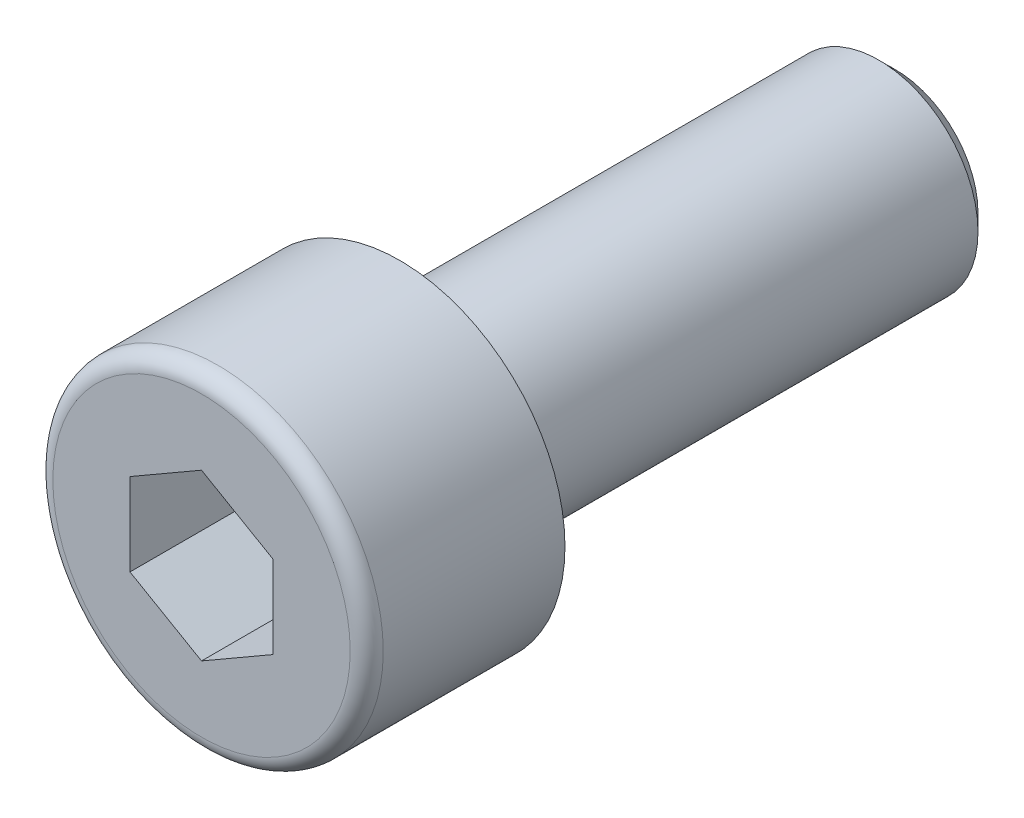
ISO-10303-21;
HEADER;
FILE_DESCRIPTION(('STEP AP214'),'2;1');
FILE_NAME('part.step','',(''),(''),'','','');
FILE_SCHEMA(('AUTOMOTIVE_DESIGN { 1 0 10303 214 1 1 1 1 }'));
ENDSEC;
DATA;
#1=APPLICATION_CONTEXT('core data for automotive mechanical design processes');
#2=APPLICATION_PROTOCOL_DEFINITION('international standard','automotive_design',2000,#1);
#3=PRODUCT_CONTEXT('',#1,'mechanical');
#4=PRODUCT('Part','Part','',(#3));
#5=PRODUCT_RELATED_PRODUCT_CATEGORY('part','',(#4));
#6=PRODUCT_DEFINITION_FORMATION('','',#4);
#7=PRODUCT_DEFINITION_CONTEXT('part definition',#1,'design');
#8=PRODUCT_DEFINITION('design','',#6,#7);
#9=PRODUCT_DEFINITION_SHAPE('','',#8);
#10=(LENGTH_UNIT() NAMED_UNIT(*) SI_UNIT(.MILLI.,.METRE.));
#11=(NAMED_UNIT(*) PLANE_ANGLE_UNIT() SI_UNIT($,.RADIAN.));
#12=(NAMED_UNIT(*) SI_UNIT($,.STERADIAN.) SOLID_ANGLE_UNIT());
#13=UNCERTAINTY_MEASURE_WITH_UNIT(LENGTH_MEASURE(1.E-05),#10,'distance_accuracy_value','');
#14=(GEOMETRIC_REPRESENTATION_CONTEXT(3) GLOBAL_UNCERTAINTY_ASSIGNED_CONTEXT((#13)) GLOBAL_UNIT_ASSIGNED_CONTEXT((#10,
#11,#12)) REPRESENTATION_CONTEXT('',''));
#15=CARTESIAN_POINT('',(0.,0.,0.));
#16=DIRECTION('',(0.,0.,1.));
#17=DIRECTION('',(1.,0.,0.));
#18=AXIS2_PLACEMENT_3D('',#15,#16,#17);
#19=CARTESIAN_POINT('',(0.,0.,15.));
#20=DIRECTION('',(0.,0.,-1.));
#21=DIRECTION('',(-1.,0.,0.));
#22=AXIS2_PLACEMENT_3D('',#19,#20,#21);
#23=CYLINDRICAL_SURFACE('',#22,3.);
#24=CARTESIAN_POINT('',(0.,0.,0.500000000000009));
#25=DIRECTION('',(0.,0.,1.));
#26=DIRECTION('',(1.,0.,0.));
#27=AXIS2_PLACEMENT_3D('',#24,#25,#26);
#28=CIRCLE('',#27,3.);
#29=CARTESIAN_POINT('',(3.,0.,0.500000000000009));
#30=VERTEX_POINT('',#29);
#31=EDGE_CURVE('E42',#30,#30,#28,.T.);
#32=ORIENTED_EDGE('',*,*,#31,.T.);
#33=EDGE_LOOP('',(#32));
#34=FACE_BOUND('',#33,.T.);
#35=CARTESIAN_POINT('',(0.,0.,15.));
#36=DIRECTION('',(0.,0.,1.));
#37=DIRECTION('',(1.,0.,0.));
#38=AXIS2_PLACEMENT_3D('',#35,#36,#37);
#39=CIRCLE('',#38,3.);
#40=CARTESIAN_POINT('',(3.,0.,15.));
#41=VERTEX_POINT('',#40);
#42=EDGE_CURVE('E145',#41,#41,#39,.T.);
#43=ORIENTED_EDGE('',*,*,#42,.F.);
#44=EDGE_LOOP('',(#43));
#45=FACE_BOUND('',#44,.T.);
#46=ADVANCED_FACE('F35',(#34,#45),#23,.T.);
#47=CARTESIAN_POINT('',(0.,0.,0.));
#48=DIRECTION('',(0.,0.,1.));
#49=DIRECTION('',(1.,0.,0.));
#50=AXIS2_PLACEMENT_3D('',#47,#48,#49);
#51=PLANE('',#50);
#52=CARTESIAN_POINT('',(0.,0.,0.));
#53=DIRECTION('',(0.,0.,1.));
#54=DIRECTION('',(1.,0.,0.));
#55=AXIS2_PLACEMENT_3D('',#52,#53,#54);
#56=CIRCLE('',#55,2.5);
#57=CARTESIAN_POINT('',(2.5,0.,0.));
#58=VERTEX_POINT('',#57);
#59=EDGE_CURVE('E11',#58,#58,#56,.F.);
#60=ORIENTED_EDGE('',*,*,#59,.T.);
#61=EDGE_LOOP('',(#60));
#62=FACE_BOUND('',#61,.T.);
#63=ADVANCED_FACE('F171',(#62),#51,.F.);
#64=CARTESIAN_POINT('',(0.,0.,15.));
#65=DIRECTION('',(0.,0.,1.));
#66=DIRECTION('',(1.,0.,0.));
#67=AXIS2_PLACEMENT_3D('',#64,#65,#66);
#68=PLANE('',#67);
#69=CARTESIAN_POINT('',(0.,0.,15.));
#70=DIRECTION('',(0.,0.,1.));
#71=DIRECTION('',(1.,0.,0.));
#72=AXIS2_PLACEMENT_3D('',#69,#70,#71);
#73=CIRCLE('',#72,5.);
#74=CARTESIAN_POINT('',(5.,0.,15.));
#75=VERTEX_POINT('',#74);
#76=EDGE_CURVE('E136',#75,#75,#73,.T.);
#77=ORIENTED_EDGE('',*,*,#76,.F.);
#78=EDGE_LOOP('',(#77));
#79=FACE_BOUND('',#78,.T.);
#80=ORIENTED_EDGE('',*,*,#42,.T.);
#81=EDGE_LOOP('',(#80));
#82=FACE_BOUND('',#81,.T.);
#83=ADVANCED_FACE('F175',(#79,#82),#68,.F.);
#84=CARTESIAN_POINT('',(0.,0.,21.));
#85=DIRECTION('',(0.,0.,-1.));
#86=DIRECTION('',(-1.,0.,0.));
#87=AXIS2_PLACEMENT_3D('',#84,#85,#86);
#88=CYLINDRICAL_SURFACE('',#87,5.);
#89=CARTESIAN_POINT('',(0.,0.,20.5));
#90=DIRECTION('',(0.,0.,1.));
#91=DIRECTION('',(1.,0.,0.));
#92=AXIS2_PLACEMENT_3D('',#89,#90,#91);
#93=CIRCLE('',#92,5.);
#94=CARTESIAN_POINT('',(5.,0.,20.5));
#95=VERTEX_POINT('',#94);
#96=EDGE_CURVE('E151',#95,#95,#93,.F.);
#97=ORIENTED_EDGE('',*,*,#96,.T.);
#98=EDGE_LOOP('',(#97));
#99=FACE_BOUND('',#98,.T.);
#100=ORIENTED_EDGE('',*,*,#76,.T.);
#101=EDGE_LOOP('',(#100));
#102=FACE_BOUND('',#101,.T.);
#103=ADVANCED_FACE('F180',(#99,#102),#88,.T.);
#104=CARTESIAN_POINT('',(0.,0.,21.));
#105=DIRECTION('',(0.,0.,1.));
#106=DIRECTION('',(1.,0.,0.));
#107=AXIS2_PLACEMENT_3D('',#104,#105,#106);
#108=PLANE('',#107);
#109=CARTESIAN_POINT('',(0.,0.,21.));
#110=DIRECTION('',(0.,0.,1.));
#111=DIRECTION('',(1.,0.,0.));
#112=AXIS2_PLACEMENT_3D('',#109,#110,#111);
#113=CIRCLE('',#112,4.5);
#114=CARTESIAN_POINT('',(4.5,0.,21.));
#115=VERTEX_POINT('',#114);
#116=EDGE_CURVE('E148',#115,#115,#113,.T.);
#117=ORIENTED_EDGE('',*,*,#116,.T.);
#118=EDGE_LOOP('',(#117));
#119=FACE_BOUND('',#118,.T.);
#120=DIRECTION('',(-0.866025403784439,0.5,0.));
#121=VECTOR('',#120,1.);
#122=CARTESIAN_POINT('',(2.1650635094611,1.25,21.));
#123=LINE('',#122,#121);
#124=CARTESIAN_POINT('',(2.1650635094611,1.25,21.));
#125=VERTEX_POINT('',#124);
#126=CARTESIAN_POINT('',(0.,2.5,21.));
#127=VERTEX_POINT('',#126);
#128=EDGE_CURVE('E49',#125,#127,#123,.T.);
#129=ORIENTED_EDGE('',*,*,#128,.F.);
#130=DIRECTION('',(0.,1.,0.));
#131=VECTOR('',#130,1.);
#132=CARTESIAN_POINT('',(2.1650635094611,-1.25,21.));
#133=LINE('',#132,#131);
#134=CARTESIAN_POINT('',(2.1650635094611,-1.25,21.));
#135=VERTEX_POINT('',#134);
#136=EDGE_CURVE('E118',#135,#125,#133,.T.);
#137=ORIENTED_EDGE('',*,*,#136,.F.);
#138=DIRECTION('',(0.866025403784439,0.5,0.));
#139=VECTOR('',#138,1.);
#140=CARTESIAN_POINT('',(0.,-2.5,21.));
#141=LINE('',#140,#139);
#142=CARTESIAN_POINT('',(0.,-2.5,21.));
#143=VERTEX_POINT('',#142);
#144=EDGE_CURVE('E112',#143,#135,#141,.T.);
#145=ORIENTED_EDGE('',*,*,#144,.F.);
#146=DIRECTION('',(0.866025403784439,-0.5,0.));
#147=VECTOR('',#146,1.);
#148=CARTESIAN_POINT('',(-2.1650635094611,-1.25,21.));
#149=LINE('',#148,#147);
#150=CARTESIAN_POINT('',(-2.1650635094611,-1.25,21.));
#151=VERTEX_POINT('',#150);
#152=EDGE_CURVE('E110',#151,#143,#149,.T.);
#153=ORIENTED_EDGE('',*,*,#152,.F.);
#154=DIRECTION('',(0.,-1.,0.));
#155=VECTOR('',#154,1.);
#156=CARTESIAN_POINT('',(-2.1650635094611,1.25,21.));
#157=LINE('',#156,#155);
#158=CARTESIAN_POINT('',(-2.1650635094611,1.25,21.));
#159=VERTEX_POINT('',#158);
#160=EDGE_CURVE('E92',#159,#151,#157,.T.);
#161=ORIENTED_EDGE('',*,*,#160,.F.);
#162=DIRECTION('',(-0.866025403784439,-0.5,0.));
#163=VECTOR('',#162,1.);
#164=CARTESIAN_POINT('',(0.,2.5,21.));
#165=LINE('',#164,#163);
#166=EDGE_CURVE('E103',#127,#159,#165,.T.);
#167=ORIENTED_EDGE('',*,*,#166,.F.);
#168=EDGE_LOOP('',(#129,#137,#145,#153,#161,#167));
#169=FACE_BOUND('',#168,.T.);
#170=ADVANCED_FACE('F107',(#119,#169),#108,.T.);
#171=CARTESIAN_POINT('',(2.1650635094611,1.25,17.5));
#172=DIRECTION('',(0.5,0.866025403784439,0.));
#173=DIRECTION('',(-0.866025403784439,0.5,0.));
#174=AXIS2_PLACEMENT_3D('',#171,#172,#173);
#175=PLANE('',#174);
#176=ORIENTED_EDGE('',*,*,#128,.T.);
#177=DIRECTION('',(0.,0.,1.));
#178=VECTOR('',#177,1.);
#179=CARTESIAN_POINT('',(0.,2.5,17.5));
#180=LINE('',#179,#178);
#181=CARTESIAN_POINT('',(0.,2.5,17.5));
#182=VERTEX_POINT('',#181);
#183=EDGE_CURVE('E100',#182,#127,#180,.T.);
#184=ORIENTED_EDGE('',*,*,#183,.F.);
#185=DIRECTION('',(-0.866025403784439,0.5,0.));
#186=VECTOR('',#185,1.);
#187=CARTESIAN_POINT('',(2.1650635094611,1.25,17.5));
#188=LINE('',#187,#186);
#189=CARTESIAN_POINT('',(2.1650635094611,1.25,17.5));
#190=VERTEX_POINT('',#189);
#191=EDGE_CURVE('E120',#190,#182,#188,.T.);
#192=ORIENTED_EDGE('',*,*,#191,.F.);
#193=DIRECTION('',(0.,0.,1.));
#194=VECTOR('',#193,1.);
#195=CARTESIAN_POINT('',(2.1650635094611,1.25,17.5));
#196=LINE('',#195,#194);
#197=EDGE_CURVE('E56',#190,#125,#196,.T.);
#198=ORIENTED_EDGE('',*,*,#197,.T.);
#199=EDGE_LOOP('',(#176,#184,#192,#198));
#200=FACE_BOUND('',#199,.T.);
#201=ADVANCED_FACE('F188',(#200),#175,.F.);
#202=CARTESIAN_POINT('',(2.1650635094611,-1.25,17.5));
#203=DIRECTION('',(1.,0.,0.));
#204=DIRECTION('',(0.,1.,0.));
#205=AXIS2_PLACEMENT_3D('',#202,#203,#204);
#206=PLANE('',#205);
#207=ORIENTED_EDGE('',*,*,#136,.T.);
#208=ORIENTED_EDGE('',*,*,#197,.F.);
#209=DIRECTION('',(0.,1.,0.));
#210=VECTOR('',#209,1.);
#211=CARTESIAN_POINT('',(2.1650635094611,-1.25,17.5));
#212=LINE('',#211,#210);
#213=CARTESIAN_POINT('',(2.1650635094611,-1.25,17.5));
#214=VERTEX_POINT('',#213);
#215=EDGE_CURVE('E132',#214,#190,#212,.T.);
#216=ORIENTED_EDGE('',*,*,#215,.F.);
#217=DIRECTION('',(0.,0.,1.));
#218=VECTOR('',#217,1.);
#219=CARTESIAN_POINT('',(2.1650635094611,-1.25,17.5));
#220=LINE('',#219,#218);
#221=EDGE_CURVE('E137',#214,#135,#220,.T.);
#222=ORIENTED_EDGE('',*,*,#221,.T.);
#223=EDGE_LOOP('',(#207,#208,#216,#222));
#224=FACE_BOUND('',#223,.T.);
#225=ADVANCED_FACE('F193',(#224),#206,.F.);
#226=CARTESIAN_POINT('',(0.,-2.5,17.5));
#227=DIRECTION('',(0.5,-0.866025403784439,0.));
#228=DIRECTION('',(0.866025403784439,0.5,0.));
#229=AXIS2_PLACEMENT_3D('',#226,#227,#228);
#230=PLANE('',#229);
#231=ORIENTED_EDGE('',*,*,#144,.T.);
#232=ORIENTED_EDGE('',*,*,#221,.F.);
#233=DIRECTION('',(0.866025403784439,0.5,0.));
#234=VECTOR('',#233,1.);
#235=CARTESIAN_POINT('',(0.,-2.5,17.5));
#236=LINE('',#235,#234);
#237=CARTESIAN_POINT('',(0.,-2.5,17.5));
#238=VERTEX_POINT('',#237);
#239=EDGE_CURVE('E129',#238,#214,#236,.T.);
#240=ORIENTED_EDGE('',*,*,#239,.F.);
#241=DIRECTION('',(0.,0.,1.));
#242=VECTOR('',#241,1.);
#243=CARTESIAN_POINT('',(0.,-2.5,17.5));
#244=LINE('',#243,#242);
#245=EDGE_CURVE('E139',#238,#143,#244,.T.);
#246=ORIENTED_EDGE('',*,*,#245,.T.);
#247=EDGE_LOOP('',(#231,#232,#240,#246));
#248=FACE_BOUND('',#247,.T.);
#249=ADVANCED_FACE('F201',(#248),#230,.F.);
#250=CARTESIAN_POINT('',(-2.1650635094611,-1.25,17.5));
#251=DIRECTION('',(-0.5,-0.866025403784439,0.));
#252=DIRECTION('',(0.866025403784439,-0.5,0.));
#253=AXIS2_PLACEMENT_3D('',#250,#251,#252);
#254=PLANE('',#253);
#255=ORIENTED_EDGE('',*,*,#152,.T.);
#256=ORIENTED_EDGE('',*,*,#245,.F.);
#257=DIRECTION('',(0.866025403784439,-0.5,0.));
#258=VECTOR('',#257,1.);
#259=CARTESIAN_POINT('',(-2.1650635094611,-1.25,17.5));
#260=LINE('',#259,#258);
#261=CARTESIAN_POINT('',(-2.1650635094611,-1.25,17.5));
#262=VERTEX_POINT('',#261);
#263=EDGE_CURVE('E126',#262,#238,#260,.T.);
#264=ORIENTED_EDGE('',*,*,#263,.F.);
#265=DIRECTION('',(0.,0.,1.));
#266=VECTOR('',#265,1.);
#267=CARTESIAN_POINT('',(-2.1650635094611,-1.25,17.5));
#268=LINE('',#267,#266);
#269=EDGE_CURVE('E99',#262,#151,#268,.T.);
#270=ORIENTED_EDGE('',*,*,#269,.T.);
#271=EDGE_LOOP('',(#255,#256,#264,#270));
#272=FACE_BOUND('',#271,.T.);
#273=ADVANCED_FACE('F198',(#272),#254,.F.);
#274=CARTESIAN_POINT('',(-2.1650635094611,1.25,17.5));
#275=DIRECTION('',(-1.,0.,0.));
#276=DIRECTION('',(0.,-1.,0.));
#277=AXIS2_PLACEMENT_3D('',#274,#275,#276);
#278=PLANE('',#277);
#279=ORIENTED_EDGE('',*,*,#160,.T.);
#280=ORIENTED_EDGE('',*,*,#269,.F.);
#281=DIRECTION('',(0.,-1.,0.));
#282=VECTOR('',#281,1.);
#283=CARTESIAN_POINT('',(-2.1650635094611,1.25,17.5));
#284=LINE('',#283,#282);
#285=CARTESIAN_POINT('',(-2.1650635094611,1.25,17.5));
#286=VERTEX_POINT('',#285);
#287=EDGE_CURVE('E95',#286,#262,#284,.T.);
#288=ORIENTED_EDGE('',*,*,#287,.F.);
#289=DIRECTION('',(0.,0.,1.));
#290=VECTOR('',#289,1.);
#291=CARTESIAN_POINT('',(-2.1650635094611,1.25,17.5));
#292=LINE('',#291,#290);
#293=EDGE_CURVE('E88',#286,#159,#292,.T.);
#294=ORIENTED_EDGE('',*,*,#293,.T.);
#295=EDGE_LOOP('',(#279,#280,#288,#294));
#296=FACE_BOUND('',#295,.T.);
#297=ADVANCED_FACE('F90',(#296),#278,.F.);
#298=CARTESIAN_POINT('',(0.,2.5,17.5));
#299=DIRECTION('',(-0.5,0.866025403784439,0.));
#300=DIRECTION('',(-0.866025403784439,-0.5,0.));
#301=AXIS2_PLACEMENT_3D('',#298,#299,#300);
#302=PLANE('',#301);
#303=ORIENTED_EDGE('',*,*,#166,.T.);
#304=ORIENTED_EDGE('',*,*,#293,.F.);
#305=DIRECTION('',(-0.866025403784439,-0.5,0.));
#306=VECTOR('',#305,1.);
#307=CARTESIAN_POINT('',(0.,2.5,17.5));
#308=LINE('',#307,#306);
#309=EDGE_CURVE('E123',#182,#286,#308,.T.);
#310=ORIENTED_EDGE('',*,*,#309,.F.);
#311=ORIENTED_EDGE('',*,*,#183,.T.);
#312=EDGE_LOOP('',(#303,#304,#310,#311));
#313=FACE_BOUND('',#312,.T.);
#314=ADVANCED_FACE('F104',(#313),#302,.F.);
#315=CARTESIAN_POINT('',(2.1650635094611,1.25,17.5));
#316=DIRECTION('',(0.,0.,-1.));
#317=DIRECTION('',(-1.,0.,0.));
#318=AXIS2_PLACEMENT_3D('',#315,#316,#317);
#319=PLANE('',#318);
#320=ORIENTED_EDGE('',*,*,#191,.T.);
#321=ORIENTED_EDGE('',*,*,#309,.T.);
#322=ORIENTED_EDGE('',*,*,#287,.T.);
#323=ORIENTED_EDGE('',*,*,#263,.T.);
#324=ORIENTED_EDGE('',*,*,#239,.T.);
#325=ORIENTED_EDGE('',*,*,#215,.T.);
#326=EDGE_LOOP('',(#320,#321,#322,#323,#324,#325));
#327=FACE_BOUND('',#326,.T.);
#328=ADVANCED_FACE('F166',(#327),#319,.F.);
#329=CARTESIAN_POINT('',(0.,0.,20.5));
#330=DIRECTION('',(0.,0.,1.));
#331=DIRECTION('',(1.,0.,0.));
#332=AXIS2_PLACEMENT_3D('',#329,#330,#331);
#333=TOROIDAL_SURFACE('',#332,4.5,0.5);
#334=ORIENTED_EDGE('',*,*,#96,.F.);
#335=EDGE_LOOP('',(#334));
#336=FACE_BOUND('',#335,.T.);
#337=ORIENTED_EDGE('',*,*,#116,.F.);
#338=EDGE_LOOP('',(#337));
#339=FACE_BOUND('',#338,.T.);
#340=ADVANCED_FACE('F160',(#336,#339),#333,.T.);
#341=CARTESIAN_POINT('',(0.,0.,0.500000000000009));
#342=DIRECTION('',(0.,0.,1.));
#343=DIRECTION('',(1.,0.,0.));
#344=AXIS2_PLACEMENT_3D('',#341,#342,#343);
#345=CONICAL_SURFACE('',#344,3.,0.785398163397443);
#346=ORIENTED_EDGE('',*,*,#59,.F.);
#347=EDGE_LOOP('',(#346));
#348=FACE_BOUND('',#347,.T.);
#349=ORIENTED_EDGE('',*,*,#31,.F.);
#350=EDGE_LOOP('',(#349));
#351=FACE_BOUND('',#350,.T.);
#352=ADVANCED_FACE('F158',(#348,#351),#345,.T.);
#353=CLOSED_SHELL('',(#46,#63,#83,#103,#170,#201,#225,#249,#273,#297,#314,#328,#340,#352));
#354=MANIFOLD_SOLID_BREP('B2',#353);
#355=ADVANCED_BREP_SHAPE_REPRESENTATION('',(#18,#354),#14);
#356=SHAPE_DEFINITION_REPRESENTATION(#9,#355);
ENDSEC;
END-ISO-10303-21;
